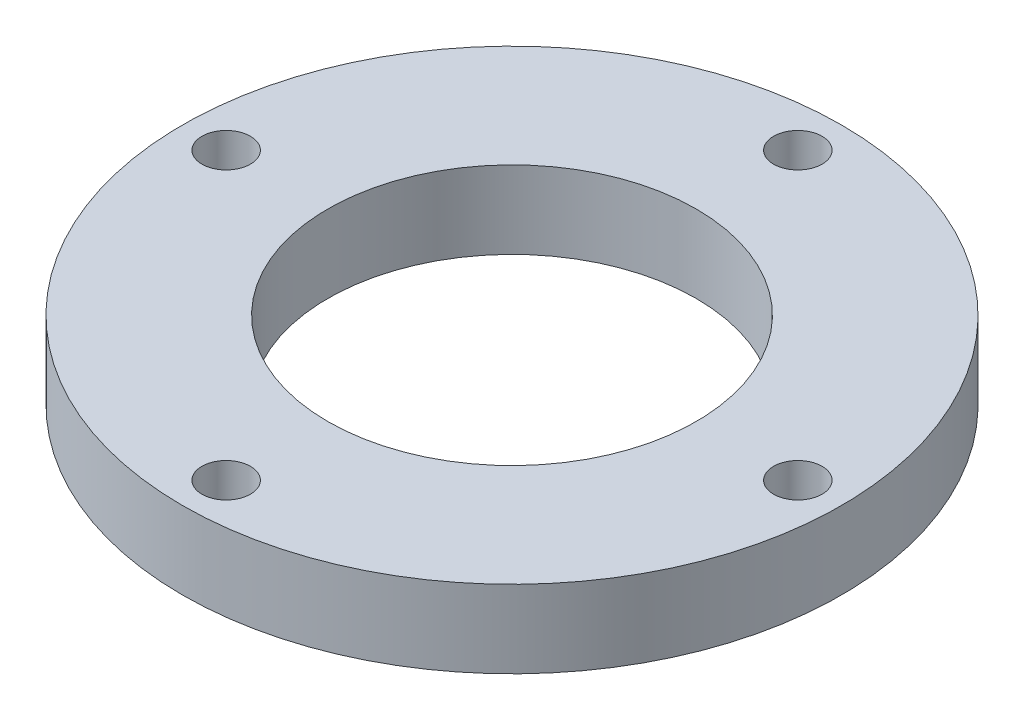
ISO-10303-21;
HEADER;
FILE_DESCRIPTION(('STEP AP214'),'2;1');
FILE_NAME('part.step','',(''),(''),'','','');
FILE_SCHEMA(('AUTOMOTIVE_DESIGN { 1 0 10303 214 1 1 1 1 }'));
ENDSEC;
DATA;
#1=APPLICATION_CONTEXT('core data for automotive mechanical design processes');
#2=APPLICATION_PROTOCOL_DEFINITION('international standard','automotive_design',2000,#1);
#3=PRODUCT_CONTEXT('',#1,'mechanical');
#4=PRODUCT('Part','Part','',(#3));
#5=PRODUCT_RELATED_PRODUCT_CATEGORY('part','',(#4));
#6=PRODUCT_DEFINITION_FORMATION('','',#4);
#7=PRODUCT_DEFINITION_CONTEXT('part definition',#1,'design');
#8=PRODUCT_DEFINITION('design','',#6,#7);
#9=PRODUCT_DEFINITION_SHAPE('','',#8);
#10=(LENGTH_UNIT() NAMED_UNIT(*) SI_UNIT(.MILLI.,.METRE.));
#11=(NAMED_UNIT(*) PLANE_ANGLE_UNIT() SI_UNIT($,.RADIAN.));
#12=(NAMED_UNIT(*) SI_UNIT($,.STERADIAN.) SOLID_ANGLE_UNIT());
#13=UNCERTAINTY_MEASURE_WITH_UNIT(LENGTH_MEASURE(1.E-05),#10,'distance_accuracy_value','');
#14=(GEOMETRIC_REPRESENTATION_CONTEXT(3) GLOBAL_UNCERTAINTY_ASSIGNED_CONTEXT((#13)) GLOBAL_UNIT_ASSIGNED_CONTEXT((#10,
#11,#12)) REPRESENTATION_CONTEXT('',''));
#15=CARTESIAN_POINT('',(0.,0.,0.));
#16=DIRECTION('',(0.,0.,1.));
#17=DIRECTION('',(1.,0.,0.));
#18=AXIS2_PLACEMENT_3D('',#15,#16,#17);
#19=CARTESIAN_POINT('',(0.,8.,0.));
#20=DIRECTION('',(0.,1.,0.));
#21=DIRECTION('',(0.,0.,1.));
#22=AXIS2_PLACEMENT_3D('',#19,#20,#21);
#23=PLANE('',#22);
#24=CARTESIAN_POINT('',(-29.4896013297072,8.,4.11849749837867E-13));
#25=DIRECTION('',(0.,1.,0.));
#26=DIRECTION('',(0.,0.,1.));
#27=AXIS2_PLACEMENT_3D('',#24,#25,#26);
#28=CIRCLE('',#27,2.50000000000081);
#29=CARTESIAN_POINT('',(-29.4896013297072,8.,2.50000000000122));
#30=VERTEX_POINT('',#29);
#31=EDGE_CURVE('E67',#30,#30,#28,.T.);
#32=ORIENTED_EDGE('',*,*,#31,.F.);
#33=EDGE_LOOP('',(#32));
#34=FACE_BOUND('',#33,.T.);
#35=CARTESIAN_POINT('',(8.30922368851046E-13,8.,29.4896013297076));
#36=DIRECTION('',(0.,1.,0.));
#37=DIRECTION('',(0.,0.,1.));
#38=AXIS2_PLACEMENT_3D('',#35,#36,#37);
#39=CIRCLE('',#38,2.50000000000099);
#40=CARTESIAN_POINT('',(8.30922368851046E-13,8.,31.9896013297086));
#41=VERTEX_POINT('',#40);
#42=EDGE_CURVE('E61',#41,#41,#39,.T.);
#43=ORIENTED_EDGE('',*,*,#42,.F.);
#44=EDGE_LOOP('',(#43));
#45=FACE_BOUND('',#44,.T.);
#46=CARTESIAN_POINT('',(29.4896013297076,8.,1.02962452368423E-13));
#47=DIRECTION('',(0.,1.,0.));
#48=DIRECTION('',(0.,0.,1.));
#49=AXIS2_PLACEMENT_3D('',#46,#47,#48);
#50=CIRCLE('',#49,2.5);
#51=CARTESIAN_POINT('',(29.4896013297076,8.,2.5000000000001));
#52=VERTEX_POINT('',#51);
#53=EDGE_CURVE('E55',#52,#52,#50,.T.);
#54=ORIENTED_EDGE('',*,*,#53,.F.);
#55=EDGE_LOOP('',(#54));
#56=FACE_BOUND('',#55,.T.);
#57=CARTESIAN_POINT('',(0.,8.,-29.4896013297076));
#58=DIRECTION('',(0.,1.,0.));
#59=DIRECTION('',(0.,0.,1.));
#60=AXIS2_PLACEMENT_3D('',#57,#58,#59);
#61=CIRCLE('',#60,2.5);
#62=CARTESIAN_POINT('',(0.,8.,-26.9896013297076));
#63=VERTEX_POINT('',#62);
#64=EDGE_CURVE('E49',#63,#63,#61,.T.);
#65=ORIENTED_EDGE('',*,*,#64,.F.);
#66=EDGE_LOOP('',(#65));
#67=FACE_BOUND('',#66,.T.);
#68=CARTESIAN_POINT('',(0.,8.,0.));
#69=DIRECTION('',(0.,1.,0.));
#70=DIRECTION('',(0.,0.,1.));
#71=AXIS2_PLACEMENT_3D('',#68,#69,#70);
#72=CIRCLE('',#71,34.);
#73=CARTESIAN_POINT('',(0.,8.,34.));
#74=VERTEX_POINT('',#73);
#75=EDGE_CURVE('E10',#74,#74,#72,.T.);
#76=ORIENTED_EDGE('',*,*,#75,.T.);
#77=EDGE_LOOP('',(#76));
#78=FACE_BOUND('',#77,.T.);
#79=CARTESIAN_POINT('',(0.,8.,0.));
#80=DIRECTION('',(0.,1.,0.));
#81=DIRECTION('',(0.,0.,1.));
#82=AXIS2_PLACEMENT_3D('',#79,#80,#81);
#83=CIRCLE('',#82,19.);
#84=CARTESIAN_POINT('',(0.,8.,19.));
#85=VERTEX_POINT('',#84);
#86=EDGE_CURVE('E41',#85,#85,#83,.T.);
#87=ORIENTED_EDGE('',*,*,#86,.F.);
#88=EDGE_LOOP('',(#87));
#89=FACE_BOUND('',#88,.T.);
#90=ADVANCED_FACE('F30',(#34,#45,#56,#67,#78,#89),#23,.T.);
#91=CARTESIAN_POINT('',(0.,0.,0.));
#92=DIRECTION('',(0.,1.,0.));
#93=DIRECTION('',(0.,0.,1.));
#94=AXIS2_PLACEMENT_3D('',#91,#92,#93);
#95=PLANE('',#94);
#96=CARTESIAN_POINT('',(-29.4896013297072,0.,4.11849749837867E-13));
#97=DIRECTION('',(0.,1.,0.));
#98=DIRECTION('',(0.,0.,1.));
#99=AXIS2_PLACEMENT_3D('',#96,#97,#98);
#100=CIRCLE('',#99,2.50000000000081);
#101=CARTESIAN_POINT('',(-29.4896013297072,0.,2.50000000000122));
#102=VERTEX_POINT('',#101);
#103=EDGE_CURVE('E64',#102,#102,#100,.T.);
#104=ORIENTED_EDGE('',*,*,#103,.T.);
#105=EDGE_LOOP('',(#104));
#106=FACE_BOUND('',#105,.T.);
#107=CARTESIAN_POINT('',(8.30922368851046E-13,0.,29.4896013297076));
#108=DIRECTION('',(0.,1.,0.));
#109=DIRECTION('',(0.,0.,1.));
#110=AXIS2_PLACEMENT_3D('',#107,#108,#109);
#111=CIRCLE('',#110,2.50000000000099);
#112=CARTESIAN_POINT('',(8.30922368851046E-13,0.,31.9896013297086));
#113=VERTEX_POINT('',#112);
#114=EDGE_CURVE('E58',#113,#113,#111,.T.);
#115=ORIENTED_EDGE('',*,*,#114,.T.);
#116=EDGE_LOOP('',(#115));
#117=FACE_BOUND('',#116,.T.);
#118=CARTESIAN_POINT('',(29.4896013297076,0.,1.02962452368423E-13));
#119=DIRECTION('',(0.,1.,0.));
#120=DIRECTION('',(0.,0.,1.));
#121=AXIS2_PLACEMENT_3D('',#118,#119,#120);
#122=CIRCLE('',#121,2.5);
#123=CARTESIAN_POINT('',(29.4896013297076,0.,2.5000000000001));
#124=VERTEX_POINT('',#123);
#125=EDGE_CURVE('E52',#124,#124,#122,.T.);
#126=ORIENTED_EDGE('',*,*,#125,.T.);
#127=EDGE_LOOP('',(#126));
#128=FACE_BOUND('',#127,.T.);
#129=CARTESIAN_POINT('',(0.,0.,-29.4896013297076));
#130=DIRECTION('',(0.,1.,0.));
#131=DIRECTION('',(0.,0.,1.));
#132=AXIS2_PLACEMENT_3D('',#129,#130,#131);
#133=CIRCLE('',#132,2.5);
#134=CARTESIAN_POINT('',(0.,0.,-26.9896013297076));
#135=VERTEX_POINT('',#134);
#136=EDGE_CURVE('E46',#135,#135,#133,.T.);
#137=ORIENTED_EDGE('',*,*,#136,.T.);
#138=EDGE_LOOP('',(#137));
#139=FACE_BOUND('',#138,.T.);
#140=CARTESIAN_POINT('',(0.,0.,0.));
#141=DIRECTION('',(0.,1.,0.));
#142=DIRECTION('',(0.,0.,1.));
#143=AXIS2_PLACEMENT_3D('',#140,#141,#142);
#144=CIRCLE('',#143,34.);
#145=CARTESIAN_POINT('',(0.,0.,34.));
#146=VERTEX_POINT('',#145);
#147=EDGE_CURVE('E34',#146,#146,#144,.T.);
#148=ORIENTED_EDGE('',*,*,#147,.F.);
#149=EDGE_LOOP('',(#148));
#150=FACE_BOUND('',#149,.T.);
#151=CARTESIAN_POINT('',(0.,0.,0.));
#152=DIRECTION('',(0.,1.,0.));
#153=DIRECTION('',(0.,0.,1.));
#154=AXIS2_PLACEMENT_3D('',#151,#152,#153);
#155=CIRCLE('',#154,19.);
#156=CARTESIAN_POINT('',(0.,0.,19.));
#157=VERTEX_POINT('',#156);
#158=EDGE_CURVE('E43',#157,#157,#155,.T.);
#159=ORIENTED_EDGE('',*,*,#158,.T.);
#160=EDGE_LOOP('',(#159));
#161=FACE_BOUND('',#160,.T.);
#162=ADVANCED_FACE('F73',(#106,#117,#128,#139,#150,#161),#95,.F.);
#163=CARTESIAN_POINT('',(0.,8.,0.));
#164=DIRECTION('',(0.,-1.,0.));
#165=DIRECTION('',(0.,0.,-1.));
#166=AXIS2_PLACEMENT_3D('',#163,#164,#165);
#167=CYLINDRICAL_SURFACE('',#166,34.);
#168=ORIENTED_EDGE('',*,*,#75,.F.);
#169=EDGE_LOOP('',(#168));
#170=FACE_BOUND('',#169,.T.);
#171=ORIENTED_EDGE('',*,*,#147,.T.);
#172=EDGE_LOOP('',(#171));
#173=FACE_BOUND('',#172,.T.);
#174=ADVANCED_FACE('F32',(#170,#173),#167,.T.);
#175=CARTESIAN_POINT('',(0.,8.,0.));
#176=DIRECTION('',(0.,-1.,0.));
#177=DIRECTION('',(0.,0.,-1.));
#178=AXIS2_PLACEMENT_3D('',#175,#176,#177);
#179=CYLINDRICAL_SURFACE('',#178,19.);
#180=ORIENTED_EDGE('',*,*,#86,.T.);
#181=EDGE_LOOP('',(#180));
#182=FACE_BOUND('',#181,.T.);
#183=ORIENTED_EDGE('',*,*,#158,.F.);
#184=EDGE_LOOP('',(#183));
#185=FACE_BOUND('',#184,.T.);
#186=ADVANCED_FACE('F94',(#182,#185),#179,.F.);
#187=CARTESIAN_POINT('',(0.,0.,-29.4896013297076));
#188=DIRECTION('',(0.,1.,0.));
#189=DIRECTION('',(0.,0.,1.));
#190=AXIS2_PLACEMENT_3D('',#187,#188,#189);
#191=CYLINDRICAL_SURFACE('',#190,2.5);
#192=ORIENTED_EDGE('',*,*,#136,.F.);
#193=EDGE_LOOP('',(#192));
#194=FACE_BOUND('',#193,.T.);
#195=ORIENTED_EDGE('',*,*,#64,.T.);
#196=EDGE_LOOP('',(#195));
#197=FACE_BOUND('',#196,.T.);
#198=ADVANCED_FACE('F97',(#194,#197),#191,.F.);
#199=CARTESIAN_POINT('',(29.4896013297076,0.,1.02962452368423E-13));
#200=DIRECTION('',(0.,1.,0.));
#201=DIRECTION('',(0.,0.,1.));
#202=AXIS2_PLACEMENT_3D('',#199,#200,#201);
#203=CYLINDRICAL_SURFACE('',#202,2.5);
#204=ORIENTED_EDGE('',*,*,#125,.F.);
#205=EDGE_LOOP('',(#204));
#206=FACE_BOUND('',#205,.T.);
#207=ORIENTED_EDGE('',*,*,#53,.T.);
#208=EDGE_LOOP('',(#207));
#209=FACE_BOUND('',#208,.T.);
#210=ADVANCED_FACE('F109',(#206,#209),#203,.F.);
#211=CARTESIAN_POINT('',(8.30922368851046E-13,0.,29.4896013297076));
#212=DIRECTION('',(0.,1.,0.));
#213=DIRECTION('',(0.,0.,1.));
#214=AXIS2_PLACEMENT_3D('',#211,#212,#213);
#215=CYLINDRICAL_SURFACE('',#214,2.50000000000099);
#216=ORIENTED_EDGE('',*,*,#114,.F.);
#217=EDGE_LOOP('',(#216));
#218=FACE_BOUND('',#217,.T.);
#219=ORIENTED_EDGE('',*,*,#42,.T.);
#220=EDGE_LOOP('',(#219));
#221=FACE_BOUND('',#220,.T.);
#222=ADVANCED_FACE('F79',(#218,#221),#215,.F.);
#223=CARTESIAN_POINT('',(-29.4896013297072,0.,4.11849749837867E-13));
#224=DIRECTION('',(0.,1.,0.));
#225=DIRECTION('',(0.,0.,1.));
#226=AXIS2_PLACEMENT_3D('',#223,#224,#225);
#227=CYLINDRICAL_SURFACE('',#226,2.50000000000081);
#228=ORIENTED_EDGE('',*,*,#103,.F.);
#229=EDGE_LOOP('',(#228));
#230=FACE_BOUND('',#229,.T.);
#231=ORIENTED_EDGE('',*,*,#31,.T.);
#232=EDGE_LOOP('',(#231));
#233=FACE_BOUND('',#232,.T.);
#234=ADVANCED_FACE('F76',(#230,#233),#227,.F.);
#235=CLOSED_SHELL('',(#90,#162,#174,#186,#198,#210,#222,#234));
#236=MANIFOLD_SOLID_BREP('B2',#235);
#237=ADVANCED_BREP_SHAPE_REPRESENTATION('',(#18,#236),#14);
#238=SHAPE_DEFINITION_REPRESENTATION(#9,#237);
ENDSEC;
END-ISO-10303-21;
